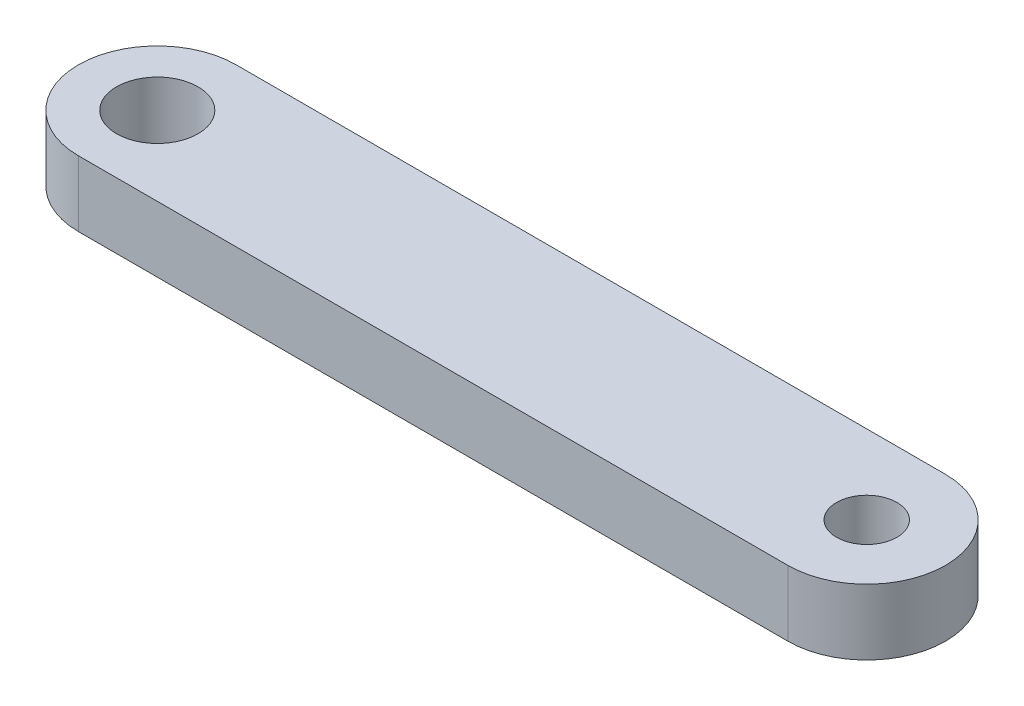
ISO-10303-21;
HEADER;
FILE_DESCRIPTION(('STEP AP214'),'2;1');
FILE_NAME('part.step','',(''),(''),'','','');
FILE_SCHEMA(('AUTOMOTIVE_DESIGN { 1 0 10303 214 1 1 1 1 }'));
ENDSEC;
DATA;
#1=APPLICATION_CONTEXT('core data for automotive mechanical design processes');
#2=APPLICATION_PROTOCOL_DEFINITION('international standard','automotive_design',2000,#1);
#3=PRODUCT_CONTEXT('',#1,'mechanical');
#4=PRODUCT('Part','Part','',(#3));
#5=PRODUCT_RELATED_PRODUCT_CATEGORY('part','',(#4));
#6=PRODUCT_DEFINITION_FORMATION('','',#4);
#7=PRODUCT_DEFINITION_CONTEXT('part definition',#1,'design');
#8=PRODUCT_DEFINITION('design','',#6,#7);
#9=PRODUCT_DEFINITION_SHAPE('','',#8);
#10=(LENGTH_UNIT() NAMED_UNIT(*) SI_UNIT(.MILLI.,.METRE.));
#11=(NAMED_UNIT(*) PLANE_ANGLE_UNIT() SI_UNIT($,.RADIAN.));
#12=(NAMED_UNIT(*) SI_UNIT($,.STERADIAN.) SOLID_ANGLE_UNIT());
#13=UNCERTAINTY_MEASURE_WITH_UNIT(LENGTH_MEASURE(1.E-05),#10,'distance_accuracy_value','');
#14=(GEOMETRIC_REPRESENTATION_CONTEXT(3) GLOBAL_UNCERTAINTY_ASSIGNED_CONTEXT((#13)) GLOBAL_UNIT_ASSIGNED_CONTEXT((#10,
#11,#12)) REPRESENTATION_CONTEXT('',''));
#15=CARTESIAN_POINT('',(0.,0.,0.));
#16=DIRECTION('',(0.,0.,1.));
#17=DIRECTION('',(1.,0.,0.));
#18=AXIS2_PLACEMENT_3D('',#15,#16,#17);
#19=CARTESIAN_POINT('',(-13.5,2.5,0.));
#20=DIRECTION('',(0.,1.,0.));
#21=DIRECTION('',(0.,0.,1.));
#22=AXIS2_PLACEMENT_3D('',#19,#20,#21);
#23=PLANE('',#22);
#24=CARTESIAN_POINT('',(-13.5,2.5,0.));
#25=DIRECTION('',(0.,1.,0.));
#26=DIRECTION('',(0.,0.,1.));
#27=AXIS2_PLACEMENT_3D('',#24,#25,#26);
#28=CIRCLE('',#27,1.55);
#29=CARTESIAN_POINT('',(-13.5,2.5,1.55));
#30=VERTEX_POINT('',#29);
#31=EDGE_CURVE('E112',#30,#30,#28,.T.);
#32=ORIENTED_EDGE('',*,*,#31,.F.);
#33=EDGE_LOOP('',(#32));
#34=FACE_BOUND('',#33,.T.);
#35=CARTESIAN_POINT('',(-13.5,2.5,0.));
#36=DIRECTION('',(0.,1.,0.));
#37=DIRECTION('',(0.,0.,1.));
#38=AXIS2_PLACEMENT_3D('',#35,#36,#37);
#39=CIRCLE('',#38,3.);
#40=CARTESIAN_POINT('',(-13.5,2.5,-3.));
#41=VERTEX_POINT('',#40);
#42=CARTESIAN_POINT('',(-13.5,2.5,3.));
#43=VERTEX_POINT('',#42);
#44=EDGE_CURVE('E92',#41,#43,#39,.T.);
#45=ORIENTED_EDGE('',*,*,#44,.T.);
#46=DIRECTION('',(1.,0.,0.));
#47=VECTOR('',#46,1.);
#48=CARTESIAN_POINT('',(-13.5,2.5,3.));
#49=LINE('',#48,#47);
#50=CARTESIAN_POINT('',(13.5,2.5,3.));
#51=VERTEX_POINT('',#50);
#52=EDGE_CURVE('E87',#43,#51,#49,.T.);
#53=ORIENTED_EDGE('',*,*,#52,.T.);
#54=CARTESIAN_POINT('',(13.5,2.5,0.));
#55=DIRECTION('',(0.,1.,0.));
#56=DIRECTION('',(0.,0.,1.));
#57=AXIS2_PLACEMENT_3D('',#54,#55,#56);
#58=CIRCLE('',#57,3.);
#59=CARTESIAN_POINT('',(13.5,2.5,-3.00000000000001));
#60=VERTEX_POINT('',#59);
#61=EDGE_CURVE('E90',#51,#60,#58,.T.);
#62=ORIENTED_EDGE('',*,*,#61,.T.);
#63=DIRECTION('',(-1.,0.,0.));
#64=VECTOR('',#63,1.);
#65=CARTESIAN_POINT('',(-13.5,2.5,-3.));
#66=LINE('',#65,#64);
#67=EDGE_CURVE('E57',#60,#41,#66,.T.);
#68=ORIENTED_EDGE('',*,*,#67,.T.);
#69=EDGE_LOOP('',(#45,#53,#62,#68));
#70=FACE_BOUND('',#69,.T.);
#71=CARTESIAN_POINT('',(13.5,2.5,0.));
#72=DIRECTION('',(0.,1.,0.));
#73=DIRECTION('',(0.,0.,1.));
#74=AXIS2_PLACEMENT_3D('',#71,#72,#73);
#75=CIRCLE('',#74,1.15);
#76=CARTESIAN_POINT('',(13.5,2.5,1.15));
#77=VERTEX_POINT('',#76);
#78=EDGE_CURVE('E134',#77,#77,#75,.T.);
#79=ORIENTED_EDGE('',*,*,#78,.F.);
#80=EDGE_LOOP('',(#79));
#81=FACE_BOUND('',#80,.T.);
#82=ADVANCED_FACE('F39',(#34,#70,#81),#23,.T.);
#83=CARTESIAN_POINT('',(-13.5,0.,0.));
#84=DIRECTION('',(0.,1.,0.));
#85=DIRECTION('',(0.,0.,1.));
#86=AXIS2_PLACEMENT_3D('',#83,#84,#85);
#87=PLANE('',#86);
#88=CARTESIAN_POINT('',(-13.5,0.,0.));
#89=DIRECTION('',(0.,1.,0.));
#90=DIRECTION('',(0.,0.,1.));
#91=AXIS2_PLACEMENT_3D('',#88,#89,#90);
#92=CIRCLE('',#91,3.);
#93=CARTESIAN_POINT('',(-13.5,0.,-3.));
#94=VERTEX_POINT('',#93);
#95=CARTESIAN_POINT('',(-13.5,0.,3.));
#96=VERTEX_POINT('',#95);
#97=EDGE_CURVE('E108',#94,#96,#92,.T.);
#98=ORIENTED_EDGE('',*,*,#97,.F.);
#99=DIRECTION('',(-1.,0.,0.));
#100=VECTOR('',#99,1.);
#101=CARTESIAN_POINT('',(-13.5,0.,-3.));
#102=LINE('',#101,#100);
#103=CARTESIAN_POINT('',(13.5,0.,-3.00000000000001));
#104=VERTEX_POINT('',#103);
#105=EDGE_CURVE('E80',#104,#94,#102,.T.);
#106=ORIENTED_EDGE('',*,*,#105,.F.);
#107=CARTESIAN_POINT('',(13.5,0.,0.));
#108=DIRECTION('',(0.,1.,0.));
#109=DIRECTION('',(0.,0.,1.));
#110=AXIS2_PLACEMENT_3D('',#107,#108,#109);
#111=CIRCLE('',#110,3.);
#112=CARTESIAN_POINT('',(13.5,0.,3.));
#113=VERTEX_POINT('',#112);
#114=EDGE_CURVE('E74',#113,#104,#111,.T.);
#115=ORIENTED_EDGE('',*,*,#114,.F.);
#116=DIRECTION('',(1.,0.,0.));
#117=VECTOR('',#116,1.);
#118=CARTESIAN_POINT('',(-13.5,0.,3.));
#119=LINE('',#118,#117);
#120=EDGE_CURVE('E97',#96,#113,#119,.T.);
#121=ORIENTED_EDGE('',*,*,#120,.F.);
#122=EDGE_LOOP('',(#98,#106,#115,#121));
#123=FACE_BOUND('',#122,.T.);
#124=CARTESIAN_POINT('',(-13.5,0.,0.));
#125=DIRECTION('',(0.,1.,0.));
#126=DIRECTION('',(0.,0.,1.));
#127=AXIS2_PLACEMENT_3D('',#124,#125,#126);
#128=CIRCLE('',#127,1.55);
#129=CARTESIAN_POINT('',(-13.5,0.,1.55));
#130=VERTEX_POINT('',#129);
#131=EDGE_CURVE('E130',#130,#130,#128,.T.);
#132=ORIENTED_EDGE('',*,*,#131,.T.);
#133=EDGE_LOOP('',(#132));
#134=FACE_BOUND('',#133,.T.);
#135=CARTESIAN_POINT('',(13.5,0.,0.));
#136=DIRECTION('',(0.,1.,0.));
#137=DIRECTION('',(0.,0.,1.));
#138=AXIS2_PLACEMENT_3D('',#135,#136,#137);
#139=CIRCLE('',#138,1.15);
#140=CARTESIAN_POINT('',(13.5,0.,1.15));
#141=VERTEX_POINT('',#140);
#142=EDGE_CURVE('E138',#141,#141,#139,.T.);
#143=ORIENTED_EDGE('',*,*,#142,.T.);
#144=EDGE_LOOP('',(#143));
#145=FACE_BOUND('',#144,.T.);
#146=ADVANCED_FACE('F125',(#123,#134,#145),#87,.F.);
#147=CARTESIAN_POINT('',(-13.5,2.5,0.));
#148=DIRECTION('',(0.,-1.,0.));
#149=DIRECTION('',(0.,0.,-1.));
#150=AXIS2_PLACEMENT_3D('',#147,#148,#149);
#151=CYLINDRICAL_SURFACE('',#150,3.);
#152=ORIENTED_EDGE('',*,*,#97,.T.);
#153=DIRECTION('',(0.,-1.,0.));
#154=VECTOR('',#153,1.);
#155=CARTESIAN_POINT('',(-13.5,2.5,3.));
#156=LINE('',#155,#154);
#157=EDGE_CURVE('E11',#43,#96,#156,.T.);
#158=ORIENTED_EDGE('',*,*,#157,.F.);
#159=ORIENTED_EDGE('',*,*,#44,.F.);
#160=DIRECTION('',(0.,-1.,0.));
#161=VECTOR('',#160,1.);
#162=CARTESIAN_POINT('',(-13.5,2.5,-3.));
#163=LINE('',#162,#161);
#164=EDGE_CURVE('E104',#41,#94,#163,.T.);
#165=ORIENTED_EDGE('',*,*,#164,.T.);
#166=EDGE_LOOP('',(#152,#158,#159,#165));
#167=FACE_BOUND('',#166,.T.);
#168=ADVANCED_FACE('F41',(#167),#151,.T.);
#169=CARTESIAN_POINT('',(-13.5,2.5,3.));
#170=DIRECTION('',(0.,0.,-1.));
#171=DIRECTION('',(-1.,0.,0.));
#172=AXIS2_PLACEMENT_3D('',#169,#170,#171);
#173=PLANE('',#172);
#174=ORIENTED_EDGE('',*,*,#120,.T.);
#175=DIRECTION('',(0.,-1.,0.));
#176=VECTOR('',#175,1.);
#177=CARTESIAN_POINT('',(13.5,2.5,3.));
#178=LINE('',#177,#176);
#179=EDGE_CURVE('E49',#51,#113,#178,.T.);
#180=ORIENTED_EDGE('',*,*,#179,.F.);
#181=ORIENTED_EDGE('',*,*,#52,.F.);
#182=ORIENTED_EDGE('',*,*,#157,.T.);
#183=EDGE_LOOP('',(#174,#180,#181,#182));
#184=FACE_BOUND('',#183,.T.);
#185=ADVANCED_FACE('F96',(#184),#173,.F.);
#186=CARTESIAN_POINT('',(13.5,2.5,0.));
#187=DIRECTION('',(0.,-1.,0.));
#188=DIRECTION('',(0.,0.,-1.));
#189=AXIS2_PLACEMENT_3D('',#186,#187,#188);
#190=CYLINDRICAL_SURFACE('',#189,3.);
#191=ORIENTED_EDGE('',*,*,#114,.T.);
#192=DIRECTION('',(0.,-1.,0.));
#193=VECTOR('',#192,1.);
#194=CARTESIAN_POINT('',(13.5,2.5,-3.00000000000001));
#195=LINE('',#194,#193);
#196=EDGE_CURVE('E99',#60,#104,#195,.T.);
#197=ORIENTED_EDGE('',*,*,#196,.F.);
#198=ORIENTED_EDGE('',*,*,#61,.F.);
#199=ORIENTED_EDGE('',*,*,#179,.T.);
#200=EDGE_LOOP('',(#191,#197,#198,#199));
#201=FACE_BOUND('',#200,.T.);
#202=ADVANCED_FACE('F100',(#201),#190,.T.);
#203=CARTESIAN_POINT('',(-13.5,2.5,-3.));
#204=DIRECTION('',(0.,0.,1.));
#205=DIRECTION('',(1.,0.,0.));
#206=AXIS2_PLACEMENT_3D('',#203,#204,#205);
#207=PLANE('',#206);
#208=ORIENTED_EDGE('',*,*,#105,.T.);
#209=ORIENTED_EDGE('',*,*,#164,.F.);
#210=ORIENTED_EDGE('',*,*,#67,.F.);
#211=ORIENTED_EDGE('',*,*,#196,.T.);
#212=EDGE_LOOP('',(#208,#209,#210,#211));
#213=FACE_BOUND('',#212,.T.);
#214=ADVANCED_FACE('F122',(#213),#207,.F.);
#215=CARTESIAN_POINT('',(-13.5,2.5,0.));
#216=DIRECTION('',(0.,-1.,0.));
#217=DIRECTION('',(0.,0.,-1.));
#218=AXIS2_PLACEMENT_3D('',#215,#216,#217);
#219=CYLINDRICAL_SURFACE('',#218,1.55);
#220=ORIENTED_EDGE('',*,*,#31,.T.);
#221=EDGE_LOOP('',(#220));
#222=FACE_BOUND('',#221,.T.);
#223=ORIENTED_EDGE('',*,*,#131,.F.);
#224=EDGE_LOOP('',(#223));
#225=FACE_BOUND('',#224,.T.);
#226=ADVANCED_FACE('F157',(#222,#225),#219,.F.);
#227=CARTESIAN_POINT('',(13.5,2.5,0.));
#228=DIRECTION('',(0.,-1.,0.));
#229=DIRECTION('',(0.,0.,-1.));
#230=AXIS2_PLACEMENT_3D('',#227,#228,#229);
#231=CYLINDRICAL_SURFACE('',#230,1.15);
#232=ORIENTED_EDGE('',*,*,#78,.T.);
#233=EDGE_LOOP('',(#232));
#234=FACE_BOUND('',#233,.T.);
#235=ORIENTED_EDGE('',*,*,#142,.F.);
#236=EDGE_LOOP('',(#235));
#237=FACE_BOUND('',#236,.T.);
#238=ADVANCED_FACE('F146',(#234,#237),#231,.F.);
#239=CLOSED_SHELL('',(#82,#146,#168,#185,#202,#214,#226,#238));
#240=MANIFOLD_SOLID_BREP('B2',#239);
#241=ADVANCED_BREP_SHAPE_REPRESENTATION('',(#18,#240),#14);
#242=SHAPE_DEFINITION_REPRESENTATION(#9,#241);
ENDSEC;
END-ISO-10303-21;
